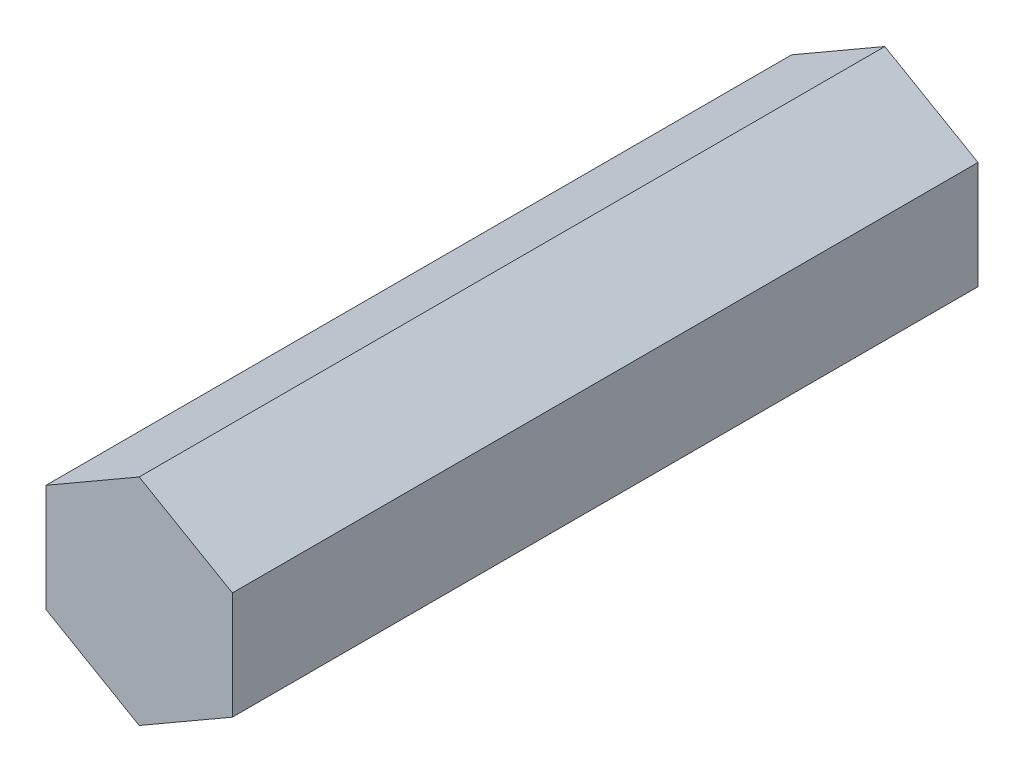
ISO-10303-21;
HEADER;
FILE_DESCRIPTION(('STEP AP214'),'2;1');
FILE_NAME('part.step','',(''),(''),'','','');
FILE_SCHEMA(('AUTOMOTIVE_DESIGN { 1 0 10303 214 1 1 1 1 }'));
ENDSEC;
DATA;
#1=APPLICATION_CONTEXT('core data for automotive mechanical design processes');
#2=APPLICATION_PROTOCOL_DEFINITION('international standard','automotive_design',2000,#1);
#3=PRODUCT_CONTEXT('',#1,'mechanical');
#4=PRODUCT('Part','Part','',(#3));
#5=PRODUCT_RELATED_PRODUCT_CATEGORY('part','',(#4));
#6=PRODUCT_DEFINITION_FORMATION('','',#4);
#7=PRODUCT_DEFINITION_CONTEXT('part definition',#1,'design');
#8=PRODUCT_DEFINITION('design','',#6,#7);
#9=PRODUCT_DEFINITION_SHAPE('','',#8);
#10=(LENGTH_UNIT() NAMED_UNIT(*) SI_UNIT(.MILLI.,.METRE.));
#11=(NAMED_UNIT(*) PLANE_ANGLE_UNIT() SI_UNIT($,.RADIAN.));
#12=(NAMED_UNIT(*) SI_UNIT($,.STERADIAN.) SOLID_ANGLE_UNIT());
#13=UNCERTAINTY_MEASURE_WITH_UNIT(LENGTH_MEASURE(1.E-05),#10,'distance_accuracy_value','');
#14=(GEOMETRIC_REPRESENTATION_CONTEXT(3) GLOBAL_UNCERTAINTY_ASSIGNED_CONTEXT((#13)) GLOBAL_UNIT_ASSIGNED_CONTEXT((#10,
#11,#12)) REPRESENTATION_CONTEXT('',''));
#15=CARTESIAN_POINT('',(0.,0.,0.));
#16=DIRECTION('',(0.,0.,1.));
#17=DIRECTION('',(1.,0.,0.));
#18=AXIS2_PLACEMENT_3D('',#15,#16,#17);
#19=CARTESIAN_POINT('',(0.,0.,0.));
#20=DIRECTION('',(0.,0.,1.));
#21=DIRECTION('',(1.,0.,0.));
#22=AXIS2_PLACEMENT_3D('',#19,#20,#21);
#23=PLANE('',#22);
#24=DIRECTION('',(0.,1.,0.));
#25=VECTOR('',#24,1.);
#26=CARTESIAN_POINT('',(15.,-8.66025403784439,0.));
#27=LINE('',#26,#25);
#28=CARTESIAN_POINT('',(15.,-8.66025403784439,0.));
#29=VERTEX_POINT('',#28);
#30=CARTESIAN_POINT('',(15.,8.66025403784439,0.));
#31=VERTEX_POINT('',#30);
#32=EDGE_CURVE('E141',#29,#31,#27,.T.);
#33=ORIENTED_EDGE('',*,*,#32,.F.);
#34=DIRECTION('',(0.866025403784439,0.5,0.));
#35=VECTOR('',#34,1.);
#36=CARTESIAN_POINT('',(0.,-17.3205080756888,0.));
#37=LINE('',#36,#35);
#38=CARTESIAN_POINT('',(0.,-17.3205080756888,0.));
#39=VERTEX_POINT('',#38);
#40=EDGE_CURVE('E91',#39,#29,#37,.T.);
#41=ORIENTED_EDGE('',*,*,#40,.F.);
#42=DIRECTION('',(0.866025403784439,-0.5,0.));
#43=VECTOR('',#42,1.);
#44=CARTESIAN_POINT('',(-15.,-8.66025403784439,0.));
#45=LINE('',#44,#43);
#46=CARTESIAN_POINT('',(-15.,-8.66025403784439,0.));
#47=VERTEX_POINT('',#46);
#48=EDGE_CURVE('E154',#47,#39,#45,.T.);
#49=ORIENTED_EDGE('',*,*,#48,.F.);
#50=DIRECTION('',(0.,-1.,0.));
#51=VECTOR('',#50,1.);
#52=CARTESIAN_POINT('',(-15.,8.66025403784439,0.));
#53=LINE('',#52,#51);
#54=CARTESIAN_POINT('',(-15.,8.66025403784439,0.));
#55=VERTEX_POINT('',#54);
#56=EDGE_CURVE('E126',#55,#47,#53,.T.);
#57=ORIENTED_EDGE('',*,*,#56,.F.);
#58=DIRECTION('',(-0.866025403784439,-0.5,0.));
#59=VECTOR('',#58,1.);
#60=CARTESIAN_POINT('',(0.,17.3205080756888,0.));
#61=LINE('',#60,#59);
#62=CARTESIAN_POINT('',(0.,17.3205080756888,0.));
#63=VERTEX_POINT('',#62);
#64=EDGE_CURVE('E149',#63,#55,#61,.T.);
#65=ORIENTED_EDGE('',*,*,#64,.F.);
#66=DIRECTION('',(-0.866025403784439,0.5,0.));
#67=VECTOR('',#66,1.);
#68=CARTESIAN_POINT('',(15.,8.66025403784439,0.));
#69=LINE('',#68,#67);
#70=EDGE_CURVE('E145',#31,#63,#69,.T.);
#71=ORIENTED_EDGE('',*,*,#70,.F.);
#72=EDGE_LOOP('',(#33,#41,#49,#57,#65,#71));
#73=FACE_BOUND('',#72,.T.);
#74=DIRECTION('',(0.,1.,0.));
#75=VECTOR('',#74,1.);
#76=CARTESIAN_POINT('',(9.,-5.19615242270663,0.));
#77=LINE('',#76,#75);
#78=CARTESIAN_POINT('',(9.,-5.19615242270663,0.));
#79=VERTEX_POINT('',#78);
#80=CARTESIAN_POINT('',(9.,5.19615242270663,0.));
#81=VERTEX_POINT('',#80);
#82=EDGE_CURVE('E55',#79,#81,#77,.T.);
#83=ORIENTED_EDGE('',*,*,#82,.T.);
#84=DIRECTION('',(-0.866025403784438,0.5,0.));
#85=VECTOR('',#84,1.);
#86=CARTESIAN_POINT('',(9.,5.19615242270663,0.));
#87=LINE('',#86,#85);
#88=CARTESIAN_POINT('',(0.,10.3923048454133,0.));
#89=VERTEX_POINT('',#88);
#90=EDGE_CURVE('E222',#81,#89,#87,.T.);
#91=ORIENTED_EDGE('',*,*,#90,.T.);
#92=DIRECTION('',(-0.866025403784439,-0.5,0.));
#93=VECTOR('',#92,1.);
#94=CARTESIAN_POINT('',(0.,10.3923048454133,0.));
#95=LINE('',#94,#93);
#96=CARTESIAN_POINT('',(-9.,5.19615242270663,0.));
#97=VERTEX_POINT('',#96);
#98=EDGE_CURVE('E218',#89,#97,#95,.T.);
#99=ORIENTED_EDGE('',*,*,#98,.T.);
#100=DIRECTION('',(0.,-1.,0.));
#101=VECTOR('',#100,1.);
#102=CARTESIAN_POINT('',(-9.,5.19615242270663,0.));
#103=LINE('',#102,#101);
#104=CARTESIAN_POINT('',(-9.,-5.19615242270663,0.));
#105=VERTEX_POINT('',#104);
#106=EDGE_CURVE('E214',#97,#105,#103,.T.);
#107=ORIENTED_EDGE('',*,*,#106,.T.);
#108=DIRECTION('',(0.866025403784439,-0.5,0.));
#109=VECTOR('',#108,1.);
#110=CARTESIAN_POINT('',(-9.,-5.19615242270663,0.));
#111=LINE('',#110,#109);
#112=CARTESIAN_POINT('',(0.,-10.3923048454133,0.));
#113=VERTEX_POINT('',#112);
#114=EDGE_CURVE('E210',#105,#113,#111,.T.);
#115=ORIENTED_EDGE('',*,*,#114,.T.);
#116=DIRECTION('',(0.866025403784439,0.5,0.));
#117=VECTOR('',#116,1.);
#118=CARTESIAN_POINT('',(0.,-10.3923048454133,0.));
#119=LINE('',#118,#117);
#120=EDGE_CURVE('E205',#113,#79,#119,.T.);
#121=ORIENTED_EDGE('',*,*,#120,.T.);
#122=EDGE_LOOP('',(#83,#91,#99,#107,#115,#121));
#123=FACE_BOUND('',#122,.T.);
#124=ADVANCED_FACE('F39',(#73,#123),#23,.F.);
#125=CARTESIAN_POINT('',(15.,-8.66025403784439,120.));
#126=DIRECTION('',(-1.,0.,0.));
#127=DIRECTION('',(0.,0.,1.));
#128=AXIS2_PLACEMENT_3D('',#125,#126,#127);
#129=PLANE('',#128);
#130=ORIENTED_EDGE('',*,*,#32,.T.);
#131=DIRECTION('',(0.,0.,-1.));
#132=VECTOR('',#131,1.);
#133=CARTESIAN_POINT('',(15.,8.66025403784439,120.));
#134=LINE('',#133,#132);
#135=CARTESIAN_POINT('',(15.,8.66025403784439,120.));
#136=VERTEX_POINT('',#135);
#137=EDGE_CURVE('E11',#136,#31,#134,.T.);
#138=ORIENTED_EDGE('',*,*,#137,.F.);
#139=DIRECTION('',(0.,1.,0.));
#140=VECTOR('',#139,1.);
#141=CARTESIAN_POINT('',(15.,-8.66025403784439,120.));
#142=LINE('',#141,#140);
#143=CARTESIAN_POINT('',(15.,-8.66025403784439,120.));
#144=VERTEX_POINT('',#143);
#145=EDGE_CURVE('E159',#144,#136,#142,.T.);
#146=ORIENTED_EDGE('',*,*,#145,.F.);
#147=DIRECTION('',(0.,0.,-1.));
#148=VECTOR('',#147,1.);
#149=CARTESIAN_POINT('',(15.,-8.66025403784439,120.));
#150=LINE('',#149,#148);
#151=EDGE_CURVE('E137',#144,#29,#150,.T.);
#152=ORIENTED_EDGE('',*,*,#151,.T.);
#153=EDGE_LOOP('',(#130,#138,#146,#152));
#154=FACE_BOUND('',#153,.T.);
#155=ADVANCED_FACE('F41',(#154),#129,.F.);
#156=CARTESIAN_POINT('',(15.,8.66025403784439,120.));
#157=DIRECTION('',(-0.5,-0.866025403784439,0.));
#158=DIRECTION('',(0.866025403784439,-0.5,0.));
#159=AXIS2_PLACEMENT_3D('',#156,#157,#158);
#160=PLANE('',#159);
#161=ORIENTED_EDGE('',*,*,#70,.T.);
#162=DIRECTION('',(0.,0.,-1.));
#163=VECTOR('',#162,1.);
#164=CARTESIAN_POINT('',(0.,17.3205080756888,120.));
#165=LINE('',#164,#163);
#166=CARTESIAN_POINT('',(0.,17.3205080756888,120.));
#167=VERTEX_POINT('',#166);
#168=EDGE_CURVE('E48',#167,#63,#165,.T.);
#169=ORIENTED_EDGE('',*,*,#168,.F.);
#170=DIRECTION('',(-0.866025403784439,0.5,0.));
#171=VECTOR('',#170,1.);
#172=CARTESIAN_POINT('',(15.,8.66025403784439,120.));
#173=LINE('',#172,#171);
#174=EDGE_CURVE('E99',#136,#167,#173,.T.);
#175=ORIENTED_EDGE('',*,*,#174,.F.);
#176=ORIENTED_EDGE('',*,*,#137,.T.);
#177=EDGE_LOOP('',(#161,#169,#175,#176));
#178=FACE_BOUND('',#177,.T.);
#179=ADVANCED_FACE('F309',(#178),#160,.F.);
#180=CARTESIAN_POINT('',(0.,17.3205080756888,120.));
#181=DIRECTION('',(0.5,-0.866025403784438,0.));
#182=DIRECTION('',(0.866025403784439,0.5,0.));
#183=AXIS2_PLACEMENT_3D('',#180,#181,#182);
#184=PLANE('',#183);
#185=ORIENTED_EDGE('',*,*,#64,.T.);
#186=DIRECTION('',(0.,0.,-1.));
#187=VECTOR('',#186,1.);
#188=CARTESIAN_POINT('',(-15.,8.66025403784439,120.));
#189=LINE('',#188,#187);
#190=CARTESIAN_POINT('',(-15.,8.66025403784439,120.));
#191=VERTEX_POINT('',#190);
#192=EDGE_CURVE('E130',#191,#55,#189,.T.);
#193=ORIENTED_EDGE('',*,*,#192,.F.);
#194=DIRECTION('',(-0.866025403784439,-0.5,0.));
#195=VECTOR('',#194,1.);
#196=CARTESIAN_POINT('',(0.,17.3205080756888,120.));
#197=LINE('',#196,#195);
#198=EDGE_CURVE('E116',#167,#191,#197,.T.);
#199=ORIENTED_EDGE('',*,*,#198,.F.);
#200=ORIENTED_EDGE('',*,*,#168,.T.);
#201=EDGE_LOOP('',(#185,#193,#199,#200));
#202=FACE_BOUND('',#201,.T.);
#203=ADVANCED_FACE('F169',(#202),#184,.F.);
#204=CARTESIAN_POINT('',(-15.,8.66025403784439,120.));
#205=DIRECTION('',(1.,0.,0.));
#206=DIRECTION('',(0.,0.,-1.));
#207=AXIS2_PLACEMENT_3D('',#204,#205,#206);
#208=PLANE('',#207);
#209=ORIENTED_EDGE('',*,*,#56,.T.);
#210=DIRECTION('',(0.,0.,-1.));
#211=VECTOR('',#210,1.);
#212=CARTESIAN_POINT('',(-15.,-8.66025403784439,120.));
#213=LINE('',#212,#211);
#214=CARTESIAN_POINT('',(-15.,-8.66025403784439,120.));
#215=VERTEX_POINT('',#214);
#216=EDGE_CURVE('E123',#215,#47,#213,.T.);
#217=ORIENTED_EDGE('',*,*,#216,.F.);
#218=DIRECTION('',(0.,-1.,0.));
#219=VECTOR('',#218,1.);
#220=CARTESIAN_POINT('',(-15.,8.66025403784439,120.));
#221=LINE('',#220,#219);
#222=EDGE_CURVE('E109',#191,#215,#221,.T.);
#223=ORIENTED_EDGE('',*,*,#222,.F.);
#224=ORIENTED_EDGE('',*,*,#192,.T.);
#225=EDGE_LOOP('',(#209,#217,#223,#224));
#226=FACE_BOUND('',#225,.T.);
#227=ADVANCED_FACE('F124',(#226),#208,.F.);
#228=CARTESIAN_POINT('',(-15.,-8.66025403784439,120.));
#229=DIRECTION('',(0.5,0.866025403784439,0.));
#230=DIRECTION('',(-0.866025403784439,0.5,0.));
#231=AXIS2_PLACEMENT_3D('',#228,#229,#230);
#232=PLANE('',#231);
#233=ORIENTED_EDGE('',*,*,#48,.T.);
#234=DIRECTION('',(0.,0.,-1.));
#235=VECTOR('',#234,1.);
#236=CARTESIAN_POINT('',(0.,-17.3205080756888,120.));
#237=LINE('',#236,#235);
#238=CARTESIAN_POINT('',(0.,-17.3205080756888,120.));
#239=VERTEX_POINT('',#238);
#240=EDGE_CURVE('E131',#239,#39,#237,.T.);
#241=ORIENTED_EDGE('',*,*,#240,.F.);
#242=DIRECTION('',(0.866025403784439,-0.5,0.));
#243=VECTOR('',#242,1.);
#244=CARTESIAN_POINT('',(-15.,-8.66025403784439,120.));
#245=LINE('',#244,#243);
#246=EDGE_CURVE('E113',#215,#239,#245,.T.);
#247=ORIENTED_EDGE('',*,*,#246,.F.);
#248=ORIENTED_EDGE('',*,*,#216,.T.);
#249=EDGE_LOOP('',(#233,#241,#247,#248));
#250=FACE_BOUND('',#249,.T.);
#251=ADVANCED_FACE('F133',(#250),#232,.F.);
#252=CARTESIAN_POINT('',(0.,-17.3205080756888,120.));
#253=DIRECTION('',(-0.5,0.866025403784439,0.));
#254=DIRECTION('',(-0.866025403784439,-0.5,0.));
#255=AXIS2_PLACEMENT_3D('',#252,#253,#254);
#256=PLANE('',#255);
#257=ORIENTED_EDGE('',*,*,#40,.T.);
#258=ORIENTED_EDGE('',*,*,#151,.F.);
#259=DIRECTION('',(0.866025403784439,0.5,0.));
#260=VECTOR('',#259,1.);
#261=CARTESIAN_POINT('',(0.,-17.3205080756888,120.));
#262=LINE('',#261,#260);
#263=EDGE_CURVE('E64',#239,#144,#262,.T.);
#264=ORIENTED_EDGE('',*,*,#263,.F.);
#265=ORIENTED_EDGE('',*,*,#240,.T.);
#266=EDGE_LOOP('',(#257,#258,#264,#265));
#267=FACE_BOUND('',#266,.T.);
#268=ADVANCED_FACE('F173',(#267),#256,.F.);
#269=CARTESIAN_POINT('',(0.,0.,120.));
#270=DIRECTION('',(0.,0.,1.));
#271=DIRECTION('',(1.,0.,0.));
#272=AXIS2_PLACEMENT_3D('',#269,#270,#271);
#273=PLANE('',#272);
#274=ORIENTED_EDGE('',*,*,#145,.T.);
#275=ORIENTED_EDGE('',*,*,#174,.T.);
#276=ORIENTED_EDGE('',*,*,#198,.T.);
#277=ORIENTED_EDGE('',*,*,#222,.T.);
#278=ORIENTED_EDGE('',*,*,#246,.T.);
#279=ORIENTED_EDGE('',*,*,#263,.T.);
#280=EDGE_LOOP('',(#274,#275,#276,#277,#278,#279));
#281=FACE_BOUND('',#280,.T.);
#282=ADVANCED_FACE('F111',(#281),#273,.T.);
#283=CARTESIAN_POINT('',(9.,-5.19615242270663,40.));
#284=DIRECTION('',(-1.,0.,0.));
#285=DIRECTION('',(0.,-1.,0.));
#286=AXIS2_PLACEMENT_3D('',#283,#284,#285);
#287=PLANE('',#286);
#288=ORIENTED_EDGE('',*,*,#82,.F.);
#289=DIRECTION('',(0.,0.,-1.));
#290=VECTOR('',#289,1.);
#291=CARTESIAN_POINT('',(9.,-5.19615242270663,40.));
#292=LINE('',#291,#290);
#293=CARTESIAN_POINT('',(9.,-5.19615242270663,40.));
#294=VERTEX_POINT('',#293);
#295=EDGE_CURVE('E201',#294,#79,#292,.T.);
#296=ORIENTED_EDGE('',*,*,#295,.F.);
#297=DIRECTION('',(0.,1.,0.));
#298=VECTOR('',#297,1.);
#299=CARTESIAN_POINT('',(9.,-5.19615242270663,40.));
#300=LINE('',#299,#298);
#301=CARTESIAN_POINT('',(9.,5.19615242270663,40.));
#302=VERTEX_POINT('',#301);
#303=EDGE_CURVE('E209',#294,#302,#300,.T.);
#304=ORIENTED_EDGE('',*,*,#303,.T.);
#305=DIRECTION('',(0.,0.,-1.));
#306=VECTOR('',#305,1.);
#307=CARTESIAN_POINT('',(9.,5.19615242270663,40.));
#308=LINE('',#307,#306);
#309=EDGE_CURVE('E146',#302,#81,#308,.T.);
#310=ORIENTED_EDGE('',*,*,#309,.T.);
#311=EDGE_LOOP('',(#288,#296,#304,#310));
#312=FACE_BOUND('',#311,.T.);
#313=ADVANCED_FACE('F252',(#312),#287,.T.);
#314=CARTESIAN_POINT('',(9.,5.19615242270663,40.));
#315=DIRECTION('',(-0.5,-0.866025403784439,0.));
#316=DIRECTION('',(0.866025403784439,-0.5,0.));
#317=AXIS2_PLACEMENT_3D('',#314,#315,#316);
#318=PLANE('',#317);
#319=ORIENTED_EDGE('',*,*,#90,.F.);
#320=ORIENTED_EDGE('',*,*,#309,.F.);
#321=DIRECTION('',(-0.866025403784438,0.5,0.));
#322=VECTOR('',#321,1.);
#323=CARTESIAN_POINT('',(9.,5.19615242270663,40.));
#324=LINE('',#323,#322);
#325=CARTESIAN_POINT('',(0.,10.3923048454133,40.));
#326=VERTEX_POINT('',#325);
#327=EDGE_CURVE('E243',#302,#326,#324,.T.);
#328=ORIENTED_EDGE('',*,*,#327,.T.);
#329=DIRECTION('',(0.,0.,-1.));
#330=VECTOR('',#329,1.);
#331=CARTESIAN_POINT('',(0.,10.3923048454133,40.));
#332=LINE('',#331,#330);
#333=EDGE_CURVE('E185',#326,#89,#332,.T.);
#334=ORIENTED_EDGE('',*,*,#333,.T.);
#335=EDGE_LOOP('',(#319,#320,#328,#334));
#336=FACE_BOUND('',#335,.T.);
#337=ADVANCED_FACE('F261',(#336),#318,.T.);
#338=CARTESIAN_POINT('',(0.,10.3923048454133,40.));
#339=DIRECTION('',(0.5,-0.866025403784439,0.));
#340=DIRECTION('',(0.866025403784439,0.5,0.));
#341=AXIS2_PLACEMENT_3D('',#338,#339,#340);
#342=PLANE('',#341);
#343=ORIENTED_EDGE('',*,*,#98,.F.);
#344=ORIENTED_EDGE('',*,*,#333,.F.);
#345=DIRECTION('',(-0.866025403784439,-0.5,0.));
#346=VECTOR('',#345,1.);
#347=CARTESIAN_POINT('',(0.,10.3923048454133,40.));
#348=LINE('',#347,#346);
#349=CARTESIAN_POINT('',(-9.,5.19615242270663,40.));
#350=VERTEX_POINT('',#349);
#351=EDGE_CURVE('E239',#326,#350,#348,.T.);
#352=ORIENTED_EDGE('',*,*,#351,.T.);
#353=DIRECTION('',(0.,0.,-1.));
#354=VECTOR('',#353,1.);
#355=CARTESIAN_POINT('',(-9.,5.19615242270663,40.));
#356=LINE('',#355,#354);
#357=EDGE_CURVE('E189',#350,#97,#356,.T.);
#358=ORIENTED_EDGE('',*,*,#357,.T.);
#359=EDGE_LOOP('',(#343,#344,#352,#358));
#360=FACE_BOUND('',#359,.T.);
#361=ADVANCED_FACE('F295',(#360),#342,.T.);
#362=CARTESIAN_POINT('',(-9.,5.19615242270663,40.));
#363=DIRECTION('',(1.,0.,0.));
#364=DIRECTION('',(0.,0.,-1.));
#365=AXIS2_PLACEMENT_3D('',#362,#363,#364);
#366=PLANE('',#365);
#367=ORIENTED_EDGE('',*,*,#106,.F.);
#368=ORIENTED_EDGE('',*,*,#357,.F.);
#369=DIRECTION('',(0.,-1.,0.));
#370=VECTOR('',#369,1.);
#371=CARTESIAN_POINT('',(-9.,5.19615242270663,40.));
#372=LINE('',#371,#370);
#373=CARTESIAN_POINT('',(-9.,-5.19615242270663,40.));
#374=VERTEX_POINT('',#373);
#375=EDGE_CURVE('E235',#350,#374,#372,.T.);
#376=ORIENTED_EDGE('',*,*,#375,.T.);
#377=DIRECTION('',(0.,0.,-1.));
#378=VECTOR('',#377,1.);
#379=CARTESIAN_POINT('',(-9.,-5.19615242270663,40.));
#380=LINE('',#379,#378);
#381=EDGE_CURVE('E193',#374,#105,#380,.T.);
#382=ORIENTED_EDGE('',*,*,#381,.T.);
#383=EDGE_LOOP('',(#367,#368,#376,#382));
#384=FACE_BOUND('',#383,.T.);
#385=ADVANCED_FACE('F284',(#384),#366,.T.);
#386=CARTESIAN_POINT('',(-9.,-5.19615242270663,40.));
#387=DIRECTION('',(0.5,0.866025403784439,0.));
#388=DIRECTION('',(-0.866025403784439,0.5,0.));
#389=AXIS2_PLACEMENT_3D('',#386,#387,#388);
#390=PLANE('',#389);
#391=ORIENTED_EDGE('',*,*,#114,.F.);
#392=ORIENTED_EDGE('',*,*,#381,.F.);
#393=DIRECTION('',(0.866025403784439,-0.5,0.));
#394=VECTOR('',#393,1.);
#395=CARTESIAN_POINT('',(-9.,-5.19615242270663,40.));
#396=LINE('',#395,#394);
#397=CARTESIAN_POINT('',(0.,-10.3923048454133,40.));
#398=VERTEX_POINT('',#397);
#399=EDGE_CURVE('E231',#374,#398,#396,.T.);
#400=ORIENTED_EDGE('',*,*,#399,.T.);
#401=DIRECTION('',(0.,0.,-1.));
#402=VECTOR('',#401,1.);
#403=CARTESIAN_POINT('',(0.,-10.3923048454133,40.));
#404=LINE('',#403,#402);
#405=EDGE_CURVE('E197',#398,#113,#404,.T.);
#406=ORIENTED_EDGE('',*,*,#405,.T.);
#407=EDGE_LOOP('',(#391,#392,#400,#406));
#408=FACE_BOUND('',#407,.T.);
#409=ADVANCED_FACE('F278',(#408),#390,.T.);
#410=CARTESIAN_POINT('',(0.,-10.3923048454133,40.));
#411=DIRECTION('',(-0.5,0.866025403784439,0.));
#412=DIRECTION('',(-0.866025403784439,-0.5,0.));
#413=AXIS2_PLACEMENT_3D('',#410,#411,#412);
#414=PLANE('',#413);
#415=ORIENTED_EDGE('',*,*,#120,.F.);
#416=ORIENTED_EDGE('',*,*,#405,.F.);
#417=DIRECTION('',(0.866025403784439,0.5,0.));
#418=VECTOR('',#417,1.);
#419=CARTESIAN_POINT('',(0.,-10.3923048454133,40.));
#420=LINE('',#419,#418);
#421=EDGE_CURVE('E204',#398,#294,#420,.T.);
#422=ORIENTED_EDGE('',*,*,#421,.T.);
#423=ORIENTED_EDGE('',*,*,#295,.T.);
#424=EDGE_LOOP('',(#415,#416,#422,#423));
#425=FACE_BOUND('',#424,.T.);
#426=ADVANCED_FACE('F282',(#425),#414,.T.);
#427=CARTESIAN_POINT('',(0.,0.,40.));
#428=DIRECTION('',(0.,0.,1.));
#429=DIRECTION('',(1.,0.,0.));
#430=AXIS2_PLACEMENT_3D('',#427,#428,#429);
#431=PLANE('',#430);
#432=ORIENTED_EDGE('',*,*,#303,.F.);
#433=ORIENTED_EDGE('',*,*,#421,.F.);
#434=ORIENTED_EDGE('',*,*,#399,.F.);
#435=ORIENTED_EDGE('',*,*,#375,.F.);
#436=ORIENTED_EDGE('',*,*,#351,.F.);
#437=ORIENTED_EDGE('',*,*,#327,.F.);
#438=EDGE_LOOP('',(#432,#433,#434,#435,#436,#437));
#439=FACE_BOUND('',#438,.T.);
#440=ADVANCED_FACE('F291',(#439),#431,.F.);
#441=CLOSED_SHELL('',(#124,#155,#179,#203,#227,#251,#268,#282,#313,#337,#361,#385,#409,#426,#440));
#442=MANIFOLD_SOLID_BREP('B2',#441);
#443=ADVANCED_BREP_SHAPE_REPRESENTATION('',(#18,#442),#14);
#444=SHAPE_DEFINITION_REPRESENTATION(#9,#443);
ENDSEC;
END-ISO-10303-21;
